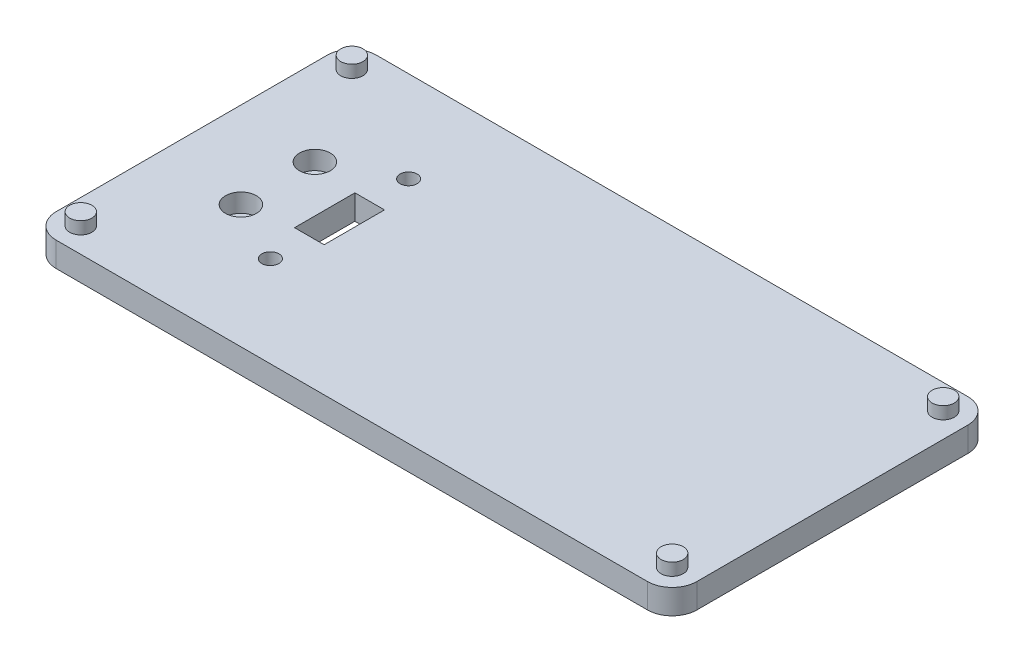
ISO-10303-21;
HEADER;
FILE_DESCRIPTION(('STEP AP214'),'2;1');
FILE_NAME('part.step','',(''),(''),'','','');
FILE_SCHEMA(('AUTOMOTIVE_DESIGN { 1 0 10303 214 1 1 1 1 }'));
ENDSEC;
DATA;
#1=APPLICATION_CONTEXT('core data for automotive mechanical design processes');
#2=APPLICATION_PROTOCOL_DEFINITION('international standard','automotive_design',2000,#1);
#3=PRODUCT_CONTEXT('',#1,'mechanical');
#4=PRODUCT('Part','Part','',(#3));
#5=PRODUCT_RELATED_PRODUCT_CATEGORY('part','',(#4));
#6=PRODUCT_DEFINITION_FORMATION('','',#4);
#7=PRODUCT_DEFINITION_CONTEXT('part definition',#1,'design');
#8=PRODUCT_DEFINITION('design','',#6,#7);
#9=PRODUCT_DEFINITION_SHAPE('','',#8);
#10=(LENGTH_UNIT() NAMED_UNIT(*) SI_UNIT(.MILLI.,.METRE.));
#11=(NAMED_UNIT(*) PLANE_ANGLE_UNIT() SI_UNIT($,.RADIAN.));
#12=(NAMED_UNIT(*) SI_UNIT($,.STERADIAN.) SOLID_ANGLE_UNIT());
#13=UNCERTAINTY_MEASURE_WITH_UNIT(LENGTH_MEASURE(1.E-05),#10,'distance_accuracy_value','');
#14=(GEOMETRIC_REPRESENTATION_CONTEXT(3) GLOBAL_UNCERTAINTY_ASSIGNED_CONTEXT((#13)) GLOBAL_UNIT_ASSIGNED_CONTEXT((#10,
#11,#12)) REPRESENTATION_CONTEXT('',''));
#15=CARTESIAN_POINT('',(0.,0.,0.));
#16=DIRECTION('',(0.,0.,1.));
#17=DIRECTION('',(1.,0.,0.));
#18=AXIS2_PLACEMENT_3D('',#15,#16,#17);
#19=CARTESIAN_POINT('',(0.,5.08,0.));
#20=DIRECTION('',(1.,0.,0.));
#21=DIRECTION('',(0.,0.,-1.));
#22=AXIS2_PLACEMENT_3D('',#19,#20,#21);
#23=PLANE('',#22);
#24=DIRECTION('',(0.,0.,1.));
#25=VECTOR('',#24,1.);
#26=CARTESIAN_POINT('',(0.,5.08,0.));
#27=LINE('',#26,#25);
#28=CARTESIAN_POINT('',(0.,5.08,-60.96));
#29=VERTEX_POINT('',#28);
#30=CARTESIAN_POINT('',(0.,5.08,-5.08));
#31=VERTEX_POINT('',#30);
#32=EDGE_CURVE('E169',#29,#31,#27,.T.);
#33=ORIENTED_EDGE('',*,*,#32,.F.);
#34=DIRECTION('',(0.,-1.,0.));
#35=VECTOR('',#34,1.);
#36=CARTESIAN_POINT('',(0.,5.08,-60.96));
#37=LINE('',#36,#35);
#38=CARTESIAN_POINT('',(0.,0.,-60.96));
#39=VERTEX_POINT('',#38);
#40=EDGE_CURVE('E184',#29,#39,#37,.T.);
#41=ORIENTED_EDGE('',*,*,#40,.T.);
#42=DIRECTION('',(0.,0.,1.));
#43=VECTOR('',#42,1.);
#44=CARTESIAN_POINT('',(0.,0.,0.));
#45=LINE('',#44,#43);
#46=CARTESIAN_POINT('',(0.,0.,-5.08));
#47=VERTEX_POINT('',#46);
#48=EDGE_CURVE('E138',#39,#47,#45,.T.);
#49=ORIENTED_EDGE('',*,*,#48,.T.);
#50=DIRECTION('',(0.,-1.,0.));
#51=VECTOR('',#50,1.);
#52=CARTESIAN_POINT('',(0.,5.08,-5.08));
#53=LINE('',#52,#51);
#54=EDGE_CURVE('E177',#47,#31,#53,.F.);
#55=ORIENTED_EDGE('',*,*,#54,.T.);
#56=EDGE_LOOP('',(#33,#41,#49,#55));
#57=FACE_BOUND('',#56,.T.);
#58=ADVANCED_FACE('F35',(#57),#23,.F.);
#59=CARTESIAN_POINT('',(0.,5.08,0.));
#60=DIRECTION('',(0.,0.,-1.));
#61=DIRECTION('',(-1.,0.,0.));
#62=AXIS2_PLACEMENT_3D('',#59,#60,#61);
#63=PLANE('',#62);
#64=DIRECTION('',(1.,0.,0.));
#65=VECTOR('',#64,1.);
#66=CARTESIAN_POINT('',(0.,0.,0.));
#67=LINE('',#66,#65);
#68=CARTESIAN_POINT('',(5.08,0.,0.));
#69=VERTEX_POINT('',#68);
#70=CARTESIAN_POINT('',(127.,0.,0.));
#71=VERTEX_POINT('',#70);
#72=EDGE_CURVE('E180',#69,#71,#67,.T.);
#73=ORIENTED_EDGE('',*,*,#72,.T.);
#74=DIRECTION('',(0.,-1.,0.));
#75=VECTOR('',#74,1.);
#76=CARTESIAN_POINT('',(127.,5.08,0.));
#77=LINE('',#76,#75);
#78=CARTESIAN_POINT('',(127.,5.08,0.));
#79=VERTEX_POINT('',#78);
#80=EDGE_CURVE('E58',#71,#79,#77,.F.);
#81=ORIENTED_EDGE('',*,*,#80,.T.);
#82=DIRECTION('',(1.,0.,0.));
#83=VECTOR('',#82,1.);
#84=CARTESIAN_POINT('',(0.,5.08,0.));
#85=LINE('',#84,#83);
#86=CARTESIAN_POINT('',(5.08,5.08,0.));
#87=VERTEX_POINT('',#86);
#88=EDGE_CURVE('E172',#87,#79,#85,.T.);
#89=ORIENTED_EDGE('',*,*,#88,.F.);
#90=DIRECTION('',(0.,-1.,0.));
#91=VECTOR('',#90,1.);
#92=CARTESIAN_POINT('',(5.08,5.08,0.));
#93=LINE('',#92,#91);
#94=EDGE_CURVE('E199',#87,#69,#93,.T.);
#95=ORIENTED_EDGE('',*,*,#94,.T.);
#96=EDGE_LOOP('',(#73,#81,#89,#95));
#97=FACE_BOUND('',#96,.T.);
#98=ADVANCED_FACE('F324',(#97),#63,.F.);
#99=CARTESIAN_POINT('',(0.,5.08,-66.04));
#100=DIRECTION('',(0.,0.,1.));
#101=DIRECTION('',(1.,0.,0.));
#102=AXIS2_PLACEMENT_3D('',#99,#100,#101);
#103=PLANE('',#102);
#104=DIRECTION('',(-1.,0.,0.));
#105=VECTOR('',#104,1.);
#106=CARTESIAN_POINT('',(0.,5.08,-66.04));
#107=LINE('',#106,#105);
#108=CARTESIAN_POINT('',(127.,5.08,-66.04));
#109=VERTEX_POINT('',#108);
#110=CARTESIAN_POINT('',(5.07999999999999,5.08,-66.04));
#111=VERTEX_POINT('',#110);
#112=EDGE_CURVE('E175',#109,#111,#107,.T.);
#113=ORIENTED_EDGE('',*,*,#112,.F.);
#114=DIRECTION('',(0.,-1.,0.));
#115=VECTOR('',#114,1.);
#116=CARTESIAN_POINT('',(127.,0.,-66.04));
#117=LINE('',#116,#115);
#118=CARTESIAN_POINT('',(127.,0.,-66.04));
#119=VERTEX_POINT('',#118);
#120=EDGE_CURVE('E215',#109,#119,#117,.T.);
#121=ORIENTED_EDGE('',*,*,#120,.T.);
#122=DIRECTION('',(-1.,0.,0.));
#123=VECTOR('',#122,1.);
#124=CARTESIAN_POINT('',(0.,0.,-66.04));
#125=LINE('',#124,#123);
#126=CARTESIAN_POINT('',(5.07999999999999,0.,-66.04));
#127=VERTEX_POINT('',#126);
#128=EDGE_CURVE('E173',#119,#127,#125,.T.);
#129=ORIENTED_EDGE('',*,*,#128,.T.);
#130=DIRECTION('',(0.,-1.,0.));
#131=VECTOR('',#130,1.);
#132=CARTESIAN_POINT('',(5.07999999999999,5.08,-66.04));
#133=LINE('',#132,#131);
#134=EDGE_CURVE('E192',#127,#111,#133,.F.);
#135=ORIENTED_EDGE('',*,*,#134,.T.);
#136=EDGE_LOOP('',(#113,#121,#129,#135));
#137=FACE_BOUND('',#136,.T.);
#138=ADVANCED_FACE('F231',(#137),#103,.F.);
#139=CARTESIAN_POINT('',(0.,5.08,0.));
#140=DIRECTION('',(0.,-1.,0.));
#141=DIRECTION('',(0.,0.,-1.));
#142=AXIS2_PLACEMENT_3D('',#139,#140,#141);
#143=PLANE('',#142);
#144=CARTESIAN_POINT('',(5.07999999999999,5.08,-5.08));
#145=DIRECTION('',(0.,-1.,0.));
#146=DIRECTION('',(0.,0.,-1.));
#147=AXIS2_PLACEMENT_3D('',#144,#145,#146);
#148=CIRCLE('',#147,2.286);
#149=CARTESIAN_POINT('',(5.07999999999999,5.08,-7.366));
#150=VERTEX_POINT('',#149);
#151=EDGE_CURVE('E11',#150,#150,#148,.F.);
#152=ORIENTED_EDGE('',*,*,#151,.F.);
#153=EDGE_LOOP('',(#152));
#154=FACE_BOUND('',#153,.T.);
#155=CARTESIAN_POINT('',(127.,5.08,-5.08));
#156=DIRECTION('',(0.,-1.,0.));
#157=DIRECTION('',(0.,0.,-1.));
#158=AXIS2_PLACEMENT_3D('',#155,#156,#157);
#159=CIRCLE('',#158,2.28600000000001);
#160=CARTESIAN_POINT('',(127.,5.08,-7.36600000000001));
#161=VERTEX_POINT('',#160);
#162=EDGE_CURVE('E43',#161,#161,#159,.F.);
#163=ORIENTED_EDGE('',*,*,#162,.F.);
#164=EDGE_LOOP('',(#163));
#165=FACE_BOUND('',#164,.T.);
#166=CARTESIAN_POINT('',(127.,5.08,-60.96));
#167=DIRECTION('',(0.,-1.,0.));
#168=DIRECTION('',(0.,0.,-1.));
#169=AXIS2_PLACEMENT_3D('',#166,#167,#168);
#170=CIRCLE('',#169,2.28600000000001);
#171=CARTESIAN_POINT('',(127.,5.08,-63.246));
#172=VERTEX_POINT('',#171);
#173=EDGE_CURVE('E221',#172,#172,#170,.F.);
#174=ORIENTED_EDGE('',*,*,#173,.F.);
#175=EDGE_LOOP('',(#174));
#176=FACE_BOUND('',#175,.T.);
#177=CARTESIAN_POINT('',(5.07999999999999,5.08,-60.96));
#178=DIRECTION('',(0.,-1.,0.));
#179=DIRECTION('',(0.,0.,-1.));
#180=AXIS2_PLACEMENT_3D('',#177,#178,#179);
#181=CIRCLE('',#180,2.286);
#182=CARTESIAN_POINT('',(5.07999999999999,5.08,-63.246));
#183=VERTEX_POINT('',#182);
#184=EDGE_CURVE('E218',#183,#183,#181,.F.);
#185=ORIENTED_EDGE('',*,*,#184,.F.);
#186=EDGE_LOOP('',(#185));
#187=FACE_BOUND('',#186,.T.);
#188=CARTESIAN_POINT('',(17.78,5.08,-40.64));
#189=DIRECTION('',(0.,1.,0.));
#190=DIRECTION('',(0.,0.,1.));
#191=AXIS2_PLACEMENT_3D('',#188,#189,#190);
#192=CIRCLE('',#191,3.175);
#193=CARTESIAN_POINT('',(17.78,5.08,-37.465));
#194=VERTEX_POINT('',#193);
#195=EDGE_CURVE('E241',#194,#194,#192,.T.);
#196=ORIENTED_EDGE('',*,*,#195,.F.);
#197=EDGE_LOOP('',(#196));
#198=FACE_BOUND('',#197,.T.);
#199=CARTESIAN_POINT('',(17.78,5.08,-25.4));
#200=DIRECTION('',(0.,1.,0.));
#201=DIRECTION('',(0.,0.,1.));
#202=AXIS2_PLACEMENT_3D('',#199,#200,#201);
#203=CIRCLE('',#202,3.175);
#204=CARTESIAN_POINT('',(17.78,5.08,-22.225));
#205=VERTEX_POINT('',#204);
#206=EDGE_CURVE('E245',#205,#205,#203,.T.);
#207=ORIENTED_EDGE('',*,*,#206,.F.);
#208=EDGE_LOOP('',(#207));
#209=FACE_BOUND('',#208,.T.);
#210=CARTESIAN_POINT('',(30.48,5.08,-18.7706));
#211=DIRECTION('',(0.,1.,0.));
#212=DIRECTION('',(0.,0.,-1.));
#213=AXIS2_PLACEMENT_3D('',#210,#211,#212);
#214=CIRCLE('',#213,1.75259999999999);
#215=CARTESIAN_POINT('',(30.48,5.08,-20.5232));
#216=VERTEX_POINT('',#215);
#217=EDGE_CURVE('E249',#216,#216,#214,.T.);
#218=ORIENTED_EDGE('',*,*,#217,.F.);
#219=EDGE_LOOP('',(#218));
#220=FACE_BOUND('',#219,.T.);
#221=CARTESIAN_POINT('',(30.48,5.08,-47.2694));
#222=DIRECTION('',(0.,1.,0.));
#223=DIRECTION('',(0.,0.,1.));
#224=AXIS2_PLACEMENT_3D('',#221,#222,#223);
#225=CIRCLE('',#224,1.75259999999999);
#226=CARTESIAN_POINT('',(30.48,5.08,-45.5168));
#227=VERTEX_POINT('',#226);
#228=EDGE_CURVE('E253',#227,#227,#225,.T.);
#229=ORIENTED_EDGE('',*,*,#228,.F.);
#230=EDGE_LOOP('',(#229));
#231=FACE_BOUND('',#230,.T.);
#232=DIRECTION('',(1.,0.,0.));
#233=VECTOR('',#232,1.);
#234=CARTESIAN_POINT('',(27.432,5.08,-26.797));
#235=LINE('',#234,#233);
#236=CARTESIAN_POINT('',(27.432,5.08,-26.797));
#237=VERTEX_POINT('',#236);
#238=CARTESIAN_POINT('',(33.528,5.08,-26.797));
#239=VERTEX_POINT('',#238);
#240=EDGE_CURVE('E153',#237,#239,#235,.T.);
#241=ORIENTED_EDGE('',*,*,#240,.F.);
#242=DIRECTION('',(0.,0.,1.));
#243=VECTOR('',#242,1.);
#244=CARTESIAN_POINT('',(27.432,5.08,-39.243));
#245=LINE('',#244,#243);
#246=CARTESIAN_POINT('',(27.432,5.08,-39.243));
#247=VERTEX_POINT('',#246);
#248=EDGE_CURVE('E146',#247,#237,#245,.T.);
#249=ORIENTED_EDGE('',*,*,#248,.F.);
#250=DIRECTION('',(-1.,0.,0.));
#251=VECTOR('',#250,1.);
#252=CARTESIAN_POINT('',(27.432,5.08,-39.243));
#253=LINE('',#252,#251);
#254=CARTESIAN_POINT('',(33.528,5.08,-39.243));
#255=VERTEX_POINT('',#254);
#256=EDGE_CURVE('E147',#255,#247,#253,.T.);
#257=ORIENTED_EDGE('',*,*,#256,.F.);
#258=DIRECTION('',(0.,0.,-1.));
#259=VECTOR('',#258,1.);
#260=CARTESIAN_POINT('',(33.528,5.08,-39.243));
#261=LINE('',#260,#259);
#262=EDGE_CURVE('E160',#239,#255,#261,.T.);
#263=ORIENTED_EDGE('',*,*,#262,.F.);
#264=EDGE_LOOP('',(#241,#249,#257,#263));
#265=FACE_BOUND('',#264,.T.);
#266=ORIENTED_EDGE('',*,*,#88,.T.);
#267=CARTESIAN_POINT('',(127.,5.08,-5.08));
#268=DIRECTION('',(0.,-1.,0.));
#269=DIRECTION('',(0.,0.,-1.));
#270=AXIS2_PLACEMENT_3D('',#267,#268,#269);
#271=CIRCLE('',#270,5.08);
#272=CARTESIAN_POINT('',(132.08,5.08,-5.08));
#273=VERTEX_POINT('',#272);
#274=EDGE_CURVE('E213',#79,#273,#271,.F.);
#275=ORIENTED_EDGE('',*,*,#274,.T.);
#276=DIRECTION('',(0.,0.,1.));
#277=VECTOR('',#276,1.);
#278=CARTESIAN_POINT('',(132.08,5.08,0.));
#279=LINE('',#278,#277);
#280=CARTESIAN_POINT('',(132.08,5.08,-60.96));
#281=VERTEX_POINT('',#280);
#282=EDGE_CURVE('E268',#281,#273,#279,.T.);
#283=ORIENTED_EDGE('',*,*,#282,.F.);
#284=CARTESIAN_POINT('',(127.,5.08,-60.96));
#285=DIRECTION('',(0.,-1.,0.));
#286=DIRECTION('',(0.,0.,-1.));
#287=AXIS2_PLACEMENT_3D('',#284,#285,#286);
#288=CIRCLE('',#287,5.08);
#289=EDGE_CURVE('E50',#281,#109,#288,.F.);
#290=ORIENTED_EDGE('',*,*,#289,.T.);
#291=ORIENTED_EDGE('',*,*,#112,.T.);
#292=CARTESIAN_POINT('',(5.07999999999999,5.08,-60.96));
#293=DIRECTION('',(0.,-1.,0.));
#294=DIRECTION('',(0.,0.,-1.));
#295=AXIS2_PLACEMENT_3D('',#292,#293,#294);
#296=CIRCLE('',#295,5.08);
#297=EDGE_CURVE('E197',#111,#29,#296,.F.);
#298=ORIENTED_EDGE('',*,*,#297,.T.);
#299=ORIENTED_EDGE('',*,*,#32,.T.);
#300=CARTESIAN_POINT('',(5.08,5.08,-5.08));
#301=DIRECTION('',(0.,-1.,0.));
#302=DIRECTION('',(0.,0.,-1.));
#303=AXIS2_PLACEMENT_3D('',#300,#301,#302);
#304=CIRCLE('',#303,5.08);
#305=EDGE_CURVE('E195',#31,#87,#304,.F.);
#306=ORIENTED_EDGE('',*,*,#305,.T.);
#307=EDGE_LOOP('',(#266,#275,#283,#290,#291,#298,#299,#306));
#308=FACE_BOUND('',#307,.T.);
#309=ADVANCED_FACE('F228',(#154,#165,#176,#187,#198,#209,#220,#231,#265,#308),#143,.F.);
#310=CARTESIAN_POINT('',(0.,0.,0.));
#311=DIRECTION('',(0.,-1.,0.));
#312=DIRECTION('',(0.,0.,-1.));
#313=AXIS2_PLACEMENT_3D('',#310,#311,#312);
#314=PLANE('',#313);
#315=DIRECTION('',(0.,0.,1.));
#316=VECTOR('',#315,1.);
#317=CARTESIAN_POINT('',(132.08,0.,0.));
#318=LINE('',#317,#316);
#319=CARTESIAN_POINT('',(132.08,0.,-60.96));
#320=VERTEX_POINT('',#319);
#321=CARTESIAN_POINT('',(132.08,0.,-5.08));
#322=VERTEX_POINT('',#321);
#323=EDGE_CURVE('E266',#320,#322,#318,.T.);
#324=ORIENTED_EDGE('',*,*,#323,.T.);
#325=CARTESIAN_POINT('',(127.,0.,-5.08));
#326=DIRECTION('',(0.,-1.,0.));
#327=DIRECTION('',(0.,0.,-1.));
#328=AXIS2_PLACEMENT_3D('',#325,#326,#327);
#329=CIRCLE('',#328,5.08);
#330=EDGE_CURVE('E209',#322,#71,#329,.T.);
#331=ORIENTED_EDGE('',*,*,#330,.T.);
#332=ORIENTED_EDGE('',*,*,#72,.F.);
#333=CARTESIAN_POINT('',(5.08,0.,-5.08));
#334=DIRECTION('',(0.,-1.,0.));
#335=DIRECTION('',(0.,0.,-1.));
#336=AXIS2_PLACEMENT_3D('',#333,#334,#335);
#337=CIRCLE('',#336,5.08);
#338=EDGE_CURVE('E187',#69,#47,#337,.T.);
#339=ORIENTED_EDGE('',*,*,#338,.T.);
#340=ORIENTED_EDGE('',*,*,#48,.F.);
#341=CARTESIAN_POINT('',(5.07999999999999,0.,-60.96));
#342=DIRECTION('',(0.,-1.,0.));
#343=DIRECTION('',(0.,0.,-1.));
#344=AXIS2_PLACEMENT_3D('',#341,#342,#343);
#345=CIRCLE('',#344,5.08);
#346=EDGE_CURVE('E189',#39,#127,#345,.T.);
#347=ORIENTED_EDGE('',*,*,#346,.T.);
#348=ORIENTED_EDGE('',*,*,#128,.F.);
#349=CARTESIAN_POINT('',(127.,0.,-60.96));
#350=DIRECTION('',(0.,-1.,0.));
#351=DIRECTION('',(0.,0.,-1.));
#352=AXIS2_PLACEMENT_3D('',#349,#350,#351);
#353=CIRCLE('',#352,5.08);
#354=EDGE_CURVE('E207',#119,#320,#353,.T.);
#355=ORIENTED_EDGE('',*,*,#354,.T.);
#356=EDGE_LOOP('',(#324,#331,#332,#339,#340,#347,#348,#355));
#357=FACE_BOUND('',#356,.T.);
#358=CARTESIAN_POINT('',(17.78,0.,-40.64));
#359=DIRECTION('',(0.,-1.,0.));
#360=DIRECTION('',(0.,0.,-1.));
#361=AXIS2_PLACEMENT_3D('',#358,#359,#360);
#362=CIRCLE('',#361,1.9812);
#363=CARTESIAN_POINT('',(17.78,0.,-42.6212));
#364=VERTEX_POINT('',#363);
#365=EDGE_CURVE('E284',#364,#364,#362,.F.);
#366=ORIENTED_EDGE('',*,*,#365,.T.);
#367=EDGE_LOOP('',(#366));
#368=FACE_BOUND('',#367,.T.);
#369=CARTESIAN_POINT('',(17.78,0.,-25.4));
#370=DIRECTION('',(0.,-1.,0.));
#371=DIRECTION('',(0.,0.,-1.));
#372=AXIS2_PLACEMENT_3D('',#369,#370,#371);
#373=CIRCLE('',#372,1.9812);
#374=CARTESIAN_POINT('',(17.78,0.,-27.3812));
#375=VERTEX_POINT('',#374);
#376=EDGE_CURVE('E275',#375,#375,#373,.F.);
#377=ORIENTED_EDGE('',*,*,#376,.T.);
#378=EDGE_LOOP('',(#377));
#379=FACE_BOUND('',#378,.T.);
#380=CARTESIAN_POINT('',(30.48,0.,-18.7706));
#381=DIRECTION('',(0.,-1.,0.));
#382=DIRECTION('',(0.,0.,-1.));
#383=AXIS2_PLACEMENT_3D('',#380,#381,#382);
#384=CIRCLE('',#383,1.75259999999999);
#385=CARTESIAN_POINT('',(30.48,0.,-20.5232));
#386=VERTEX_POINT('',#385);
#387=EDGE_CURVE('E295',#386,#386,#384,.F.);
#388=ORIENTED_EDGE('',*,*,#387,.T.);
#389=EDGE_LOOP('',(#388));
#390=FACE_BOUND('',#389,.T.);
#391=CARTESIAN_POINT('',(30.48,0.,-47.2694));
#392=DIRECTION('',(0.,-1.,0.));
#393=DIRECTION('',(0.,0.,-1.));
#394=AXIS2_PLACEMENT_3D('',#391,#392,#393);
#395=CIRCLE('',#394,1.75259999999999);
#396=CARTESIAN_POINT('',(30.48,0.,-49.022));
#397=VERTEX_POINT('',#396);
#398=EDGE_CURVE('E302',#397,#397,#395,.F.);
#399=ORIENTED_EDGE('',*,*,#398,.T.);
#400=EDGE_LOOP('',(#399));
#401=FACE_BOUND('',#400,.T.);
#402=DIRECTION('',(0.,0.,1.));
#403=VECTOR('',#402,1.);
#404=CARTESIAN_POINT('',(27.432,0.,-39.243));
#405=LINE('',#404,#403);
#406=CARTESIAN_POINT('',(27.432,0.,-39.243));
#407=VERTEX_POINT('',#406);
#408=CARTESIAN_POINT('',(27.432,0.,-26.797));
#409=VERTEX_POINT('',#408);
#410=EDGE_CURVE('E143',#407,#409,#405,.T.);
#411=ORIENTED_EDGE('',*,*,#410,.T.);
#412=DIRECTION('',(1.,0.,0.));
#413=VECTOR('',#412,1.);
#414=CARTESIAN_POINT('',(27.432,0.,-26.797));
#415=LINE('',#414,#413);
#416=CARTESIAN_POINT('',(33.528,0.,-26.797));
#417=VERTEX_POINT('',#416);
#418=EDGE_CURVE('E127',#409,#417,#415,.T.);
#419=ORIENTED_EDGE('',*,*,#418,.T.);
#420=DIRECTION('',(0.,0.,-1.));
#421=VECTOR('',#420,1.);
#422=CARTESIAN_POINT('',(33.528,0.,-39.243));
#423=LINE('',#422,#421);
#424=CARTESIAN_POINT('',(33.528,0.,-39.243));
#425=VERTEX_POINT('',#424);
#426=EDGE_CURVE('E155',#417,#425,#423,.T.);
#427=ORIENTED_EDGE('',*,*,#426,.T.);
#428=DIRECTION('',(-1.,0.,0.));
#429=VECTOR('',#428,1.);
#430=CARTESIAN_POINT('',(27.432,0.,-39.243));
#431=LINE('',#430,#429);
#432=EDGE_CURVE('E151',#425,#407,#431,.T.);
#433=ORIENTED_EDGE('',*,*,#432,.T.);
#434=EDGE_LOOP('',(#411,#419,#427,#433));
#435=FACE_BOUND('',#434,.T.);
#436=ADVANCED_FACE('F150',(#357,#368,#379,#390,#401,#435),#314,.T.);
#437=CARTESIAN_POINT('',(5.07999999999999,5.08,-60.96));
#438=DIRECTION('',(0.,-1.,0.));
#439=DIRECTION('',(0.,0.,-1.));
#440=AXIS2_PLACEMENT_3D('',#437,#438,#439);
#441=CYLINDRICAL_SURFACE('',#440,5.08);
#442=ORIENTED_EDGE('',*,*,#297,.F.);
#443=ORIENTED_EDGE('',*,*,#134,.F.);
#444=ORIENTED_EDGE('',*,*,#346,.F.);
#445=ORIENTED_EDGE('',*,*,#40,.F.);
#446=EDGE_LOOP('',(#442,#443,#444,#445));
#447=FACE_BOUND('',#446,.T.);
#448=ADVANCED_FACE('F334',(#447),#441,.T.);
#449=CARTESIAN_POINT('',(5.08,5.08,-5.08));
#450=DIRECTION('',(0.,-1.,0.));
#451=DIRECTION('',(0.,0.,-1.));
#452=AXIS2_PLACEMENT_3D('',#449,#450,#451);
#453=CYLINDRICAL_SURFACE('',#452,5.08);
#454=ORIENTED_EDGE('',*,*,#305,.F.);
#455=ORIENTED_EDGE('',*,*,#54,.F.);
#456=ORIENTED_EDGE('',*,*,#338,.F.);
#457=ORIENTED_EDGE('',*,*,#94,.F.);
#458=EDGE_LOOP('',(#454,#455,#456,#457));
#459=FACE_BOUND('',#458,.T.);
#460=ADVANCED_FACE('F320',(#459),#453,.T.);
#461=CARTESIAN_POINT('',(27.432,-0.00100000000000013,-39.243));
#462=DIRECTION('',(-1.,0.,0.));
#463=DIRECTION('',(0.,0.,1.));
#464=AXIS2_PLACEMENT_3D('',#461,#462,#463);
#465=PLANE('',#464);
#466=DIRECTION('',(0.,1.,0.));
#467=VECTOR('',#466,1.);
#468=CARTESIAN_POINT('',(27.432,-0.00100000000000013,-39.243));
#469=LINE('',#468,#467);
#470=EDGE_CURVE('E139',#407,#247,#469,.T.);
#471=ORIENTED_EDGE('',*,*,#470,.T.);
#472=ORIENTED_EDGE('',*,*,#248,.T.);
#473=DIRECTION('',(0.,1.,0.));
#474=VECTOR('',#473,1.);
#475=CARTESIAN_POINT('',(27.432,-0.00100000000000013,-26.797));
#476=LINE('',#475,#474);
#477=EDGE_CURVE('E131',#409,#237,#476,.T.);
#478=ORIENTED_EDGE('',*,*,#477,.F.);
#479=ORIENTED_EDGE('',*,*,#410,.F.);
#480=EDGE_LOOP('',(#471,#472,#478,#479));
#481=FACE_BOUND('',#480,.T.);
#482=ADVANCED_FACE('F142',(#481),#465,.F.);
#483=CARTESIAN_POINT('',(27.432,-0.00100000000000013,-39.243));
#484=DIRECTION('',(0.,0.,-1.));
#485=DIRECTION('',(-1.,0.,0.));
#486=AXIS2_PLACEMENT_3D('',#483,#484,#485);
#487=PLANE('',#486);
#488=DIRECTION('',(0.,1.,0.));
#489=VECTOR('',#488,1.);
#490=CARTESIAN_POINT('',(33.528,-0.00100000000000013,-39.243));
#491=LINE('',#490,#489);
#492=EDGE_CURVE('E166',#425,#255,#491,.T.);
#493=ORIENTED_EDGE('',*,*,#492,.T.);
#494=ORIENTED_EDGE('',*,*,#256,.T.);
#495=ORIENTED_EDGE('',*,*,#470,.F.);
#496=ORIENTED_EDGE('',*,*,#432,.F.);
#497=EDGE_LOOP('',(#493,#494,#495,#496));
#498=FACE_BOUND('',#497,.T.);
#499=ADVANCED_FACE('F312',(#498),#487,.F.);
#500=CARTESIAN_POINT('',(33.528,-0.00100000000000013,-39.243));
#501=DIRECTION('',(1.,0.,0.));
#502=DIRECTION('',(0.,0.,-1.));
#503=AXIS2_PLACEMENT_3D('',#500,#501,#502);
#504=PLANE('',#503);
#505=DIRECTION('',(0.,1.,0.));
#506=VECTOR('',#505,1.);
#507=CARTESIAN_POINT('',(33.528,-0.00100000000000013,-26.797));
#508=LINE('',#507,#506);
#509=EDGE_CURVE('E133',#417,#239,#508,.T.);
#510=ORIENTED_EDGE('',*,*,#509,.T.);
#511=ORIENTED_EDGE('',*,*,#262,.T.);
#512=ORIENTED_EDGE('',*,*,#492,.F.);
#513=ORIENTED_EDGE('',*,*,#426,.F.);
#514=EDGE_LOOP('',(#510,#511,#512,#513));
#515=FACE_BOUND('',#514,.T.);
#516=ADVANCED_FACE('F309',(#515),#504,.F.);
#517=CARTESIAN_POINT('',(27.432,-0.00100000000000013,-26.797));
#518=DIRECTION('',(0.,0.,1.));
#519=DIRECTION('',(1.,0.,0.));
#520=AXIS2_PLACEMENT_3D('',#517,#518,#519);
#521=PLANE('',#520);
#522=ORIENTED_EDGE('',*,*,#477,.T.);
#523=ORIENTED_EDGE('',*,*,#240,.T.);
#524=ORIENTED_EDGE('',*,*,#509,.F.);
#525=ORIENTED_EDGE('',*,*,#418,.F.);
#526=EDGE_LOOP('',(#522,#523,#524,#525));
#527=FACE_BOUND('',#526,.T.);
#528=ADVANCED_FACE('F129',(#527),#521,.F.);
#529=CARTESIAN_POINT('',(30.48,-0.00100000000000013,-47.2694));
#530=DIRECTION('',(0.,1.,0.));
#531=DIRECTION('',(0.,0.,1.));
#532=AXIS2_PLACEMENT_3D('',#529,#530,#531);
#533=CYLINDRICAL_SURFACE('',#532,1.75259999999999);
#534=ORIENTED_EDGE('',*,*,#398,.F.);
#535=EDGE_LOOP('',(#534));
#536=FACE_BOUND('',#535,.T.);
#537=ORIENTED_EDGE('',*,*,#228,.T.);
#538=EDGE_LOOP('',(#537));
#539=FACE_BOUND('',#538,.T.);
#540=ADVANCED_FACE('F378',(#536,#539),#533,.F.);
#541=CARTESIAN_POINT('',(30.48,-0.00100000000000013,-18.7706));
#542=DIRECTION('',(0.,1.,0.));
#543=DIRECTION('',(0.,0.,1.));
#544=AXIS2_PLACEMENT_3D('',#541,#542,#543);
#545=CYLINDRICAL_SURFACE('',#544,1.75259999999999);
#546=ORIENTED_EDGE('',*,*,#387,.F.);
#547=EDGE_LOOP('',(#546));
#548=FACE_BOUND('',#547,.T.);
#549=ORIENTED_EDGE('',*,*,#217,.T.);
#550=EDGE_LOOP('',(#549));
#551=FACE_BOUND('',#550,.T.);
#552=ADVANCED_FACE('F376',(#548,#551),#545,.F.);
#553=CARTESIAN_POINT('',(17.78,1.27,-25.4));
#554=DIRECTION('',(0.,1.,0.));
#555=DIRECTION('',(0.,0.,1.));
#556=AXIS2_PLACEMENT_3D('',#553,#554,#555);
#557=CYLINDRICAL_SURFACE('',#556,3.175);
#558=CARTESIAN_POINT('',(17.78,1.27,-25.4));
#559=DIRECTION('',(0.,1.,0.));
#560=DIRECTION('',(0.,0.,1.));
#561=AXIS2_PLACEMENT_3D('',#558,#559,#560);
#562=CIRCLE('',#561,3.175);
#563=CARTESIAN_POINT('',(17.78,1.27,-22.225));
#564=VERTEX_POINT('',#563);
#565=EDGE_CURVE('E297',#564,#564,#562,.T.);
#566=CARTESIAN_POINT('',(17.78,1.27,-22.225));
#567=CARTESIAN_POINT('',(17.78,1.3096875,-22.225));
#568=CARTESIAN_POINT('',(17.78,1.349375,-22.225));
#569=CARTESIAN_POINT('',(17.78,1.42875,-22.225));
#570=CARTESIAN_POINT('',(17.78,1.4684375,-22.225));
#571=CARTESIAN_POINT('',(17.78,1.5478125,-22.225));
#572=CARTESIAN_POINT('',(17.78,1.5875,-22.225));
#573=CARTESIAN_POINT('',(17.78,1.666875,-22.225));
#574=CARTESIAN_POINT('',(17.78,1.7065625,-22.225));
#575=CARTESIAN_POINT('',(17.78,1.7859375,-22.225));
#576=CARTESIAN_POINT('',(17.78,1.825625,-22.225));
#577=CARTESIAN_POINT('',(17.78,1.905,-22.225));
#578=CARTESIAN_POINT('',(17.78,1.9446875,-22.225));
#579=CARTESIAN_POINT('',(17.78,2.0240625,-22.225));
#580=CARTESIAN_POINT('',(17.78,2.06375,-22.225));
#581=CARTESIAN_POINT('',(17.78,2.143125,-22.225));
#582=CARTESIAN_POINT('',(17.78,2.1828125,-22.225));
#583=CARTESIAN_POINT('',(17.78,2.2621875,-22.225));
#584=CARTESIAN_POINT('',(17.78,2.301875,-22.225));
#585=CARTESIAN_POINT('',(17.78,2.38125,-22.225));
#586=CARTESIAN_POINT('',(17.78,2.4209375,-22.225));
#587=CARTESIAN_POINT('',(17.78,2.5003125,-22.225));
#588=CARTESIAN_POINT('',(17.78,2.54,-22.225));
#589=CARTESIAN_POINT('',(17.78,2.619375,-22.225));
#590=CARTESIAN_POINT('',(17.78,2.6590625,-22.225));
#591=CARTESIAN_POINT('',(17.78,2.7384375,-22.225));
#592=CARTESIAN_POINT('',(17.78,2.778125,-22.225));
#593=CARTESIAN_POINT('',(17.78,2.8575,-22.225));
#594=CARTESIAN_POINT('',(17.78,2.8971875,-22.225));
#595=CARTESIAN_POINT('',(17.78,2.9765625,-22.225));
#596=CARTESIAN_POINT('',(17.78,3.01625,-22.225));
#597=CARTESIAN_POINT('',(17.78,3.095625,-22.225));
#598=CARTESIAN_POINT('',(17.78,3.1353125,-22.225));
#599=CARTESIAN_POINT('',(17.78,3.2146875,-22.225));
#600=CARTESIAN_POINT('',(17.78,3.254375,-22.225));
#601=CARTESIAN_POINT('',(17.78,3.33375,-22.225));
#602=CARTESIAN_POINT('',(17.78,3.3734375,-22.225));
#603=CARTESIAN_POINT('',(17.78,3.4528125,-22.225));
#604=CARTESIAN_POINT('',(17.78,3.4925,-22.225));
#605=CARTESIAN_POINT('',(17.78,3.571875,-22.225));
#606=CARTESIAN_POINT('',(17.78,3.6115625,-22.225));
#607=CARTESIAN_POINT('',(17.78,3.6909375,-22.225));
#608=CARTESIAN_POINT('',(17.78,3.730625,-22.225));
#609=CARTESIAN_POINT('',(17.78,3.81,-22.225));
#610=CARTESIAN_POINT('',(17.78,3.8496875,-22.225));
#611=CARTESIAN_POINT('',(17.78,3.9290625,-22.225));
#612=CARTESIAN_POINT('',(17.78,3.96875,-22.225));
#613=CARTESIAN_POINT('',(17.78,4.048125,-22.225));
#614=CARTESIAN_POINT('',(17.78,4.0878125,-22.225));
#615=CARTESIAN_POINT('',(17.78,4.1671875,-22.225));
#616=CARTESIAN_POINT('',(17.78,4.206875,-22.225));
#617=CARTESIAN_POINT('',(17.78,4.28625,-22.225));
#618=CARTESIAN_POINT('',(17.78,4.3259375,-22.225));
#619=CARTESIAN_POINT('',(17.78,4.4053125,-22.225));
#620=CARTESIAN_POINT('',(17.78,4.445,-22.225));
#621=CARTESIAN_POINT('',(17.78,4.524375,-22.225));
#622=CARTESIAN_POINT('',(17.78,4.5640625,-22.225));
#623=CARTESIAN_POINT('',(17.78,4.6434375,-22.225));
#624=CARTESIAN_POINT('',(17.78,4.683125,-22.225));
#625=CARTESIAN_POINT('',(17.78,4.7625,-22.225));
#626=CARTESIAN_POINT('',(17.78,4.8021875,-22.225));
#627=CARTESIAN_POINT('',(17.78,4.8815625,-22.225));
#628=CARTESIAN_POINT('',(17.78,4.92125,-22.225));
#629=CARTESIAN_POINT('',(17.78,5.000625,-22.225));
#630=CARTESIAN_POINT('',(17.78,5.0403125,-22.225));
#631=CARTESIAN_POINT('',(17.78,5.08,-22.225));
#632=B_SPLINE_CURVE_WITH_KNOTS('',3,(#566,#567,#568,#569,#570,#571,#572,#573,#574,#575,#576,
#577,#578,#579,#580,#581,#582,#583,#584,#585,#586,#587,#588,#589,#590,#591,#592,#593,#594,#595,
#596,#597,#598,#599,#600,#601,#602,#603,#604,#605,#606,#607,#608,#609,#610,#611,#612,#613,#614,
#615,#616,#617,#618,#619,#620,#621,#622,#623,#624,#625,#626,#627,#628,#629,#630,#631),
.UNSPECIFIED.,.F.,.F.,(4,2,2,2,2,2,2,2,2,2,2,2,2,2,2,2,2,2,2,2,2,2,2,2,2,2,2,2,2,2,2,2,4),(0.,
0.1190625,0.238125,0.3571875,0.47625,0.5953125,0.714375,0.833437499999999,0.9525,1.0715625,
1.190625,1.3096875,1.42875,1.5478125,1.666875,1.7859375,1.905,2.0240625,2.143125,2.2621875,
2.38125,2.5003125,2.619375,2.7384375,2.8575,2.9765625,3.095625,3.2146875,3.33375,3.4528125,
3.571875,3.6909375,3.81),.UNSPECIFIED.);
#633=EDGE_CURVE('BSEAM372',#564,#205,#632,.T.);
#634=ORIENTED_EDGE('',*,*,#565,.F.);
#635=ORIENTED_EDGE('',*,*,#206,.T.);
#636=ORIENTED_EDGE('',*,*,#633,.T.);
#637=ORIENTED_EDGE('',*,*,#633,.F.);
#638=EDGE_LOOP('',(#634,#636,#635,#637));
#639=FACE_BOUND('',#638,.T.);
#640=ADVANCED_FACE('F372',(#639),#557,.F.);
#641=CARTESIAN_POINT('',(17.78,1.27,-25.4));
#642=DIRECTION('',(0.,1.,0.));
#643=DIRECTION('',(0.,0.,1.));
#644=AXIS2_PLACEMENT_3D('',#641,#642,#643);
#645=PLANE('',#644);
#646=CARTESIAN_POINT('',(17.78,1.27,-25.4));
#647=DIRECTION('',(0.,1.,0.));
#648=DIRECTION('',(0.,0.,1.));
#649=AXIS2_PLACEMENT_3D('',#646,#647,#648);
#650=CIRCLE('',#649,1.9812);
#651=CARTESIAN_POINT('',(17.78,1.27,-23.4188));
#652=VERTEX_POINT('',#651);
#653=EDGE_CURVE('E287',#652,#652,#650,.T.);
#654=ORIENTED_EDGE('',*,*,#653,.F.);
#655=EDGE_LOOP('',(#654));
#656=FACE_BOUND('',#655,.T.);
#657=ORIENTED_EDGE('',*,*,#565,.T.);
#658=EDGE_LOOP('',(#657));
#659=FACE_BOUND('',#658,.T.);
#660=ADVANCED_FACE('F368',(#656,#659),#645,.T.);
#661=CARTESIAN_POINT('',(17.78,1.27,-40.64));
#662=DIRECTION('',(0.,1.,0.));
#663=DIRECTION('',(0.,0.,1.));
#664=AXIS2_PLACEMENT_3D('',#661,#662,#663);
#665=CYLINDRICAL_SURFACE('',#664,3.175);
#666=CARTESIAN_POINT('',(17.78,1.27,-40.64));
#667=DIRECTION('',(0.,1.,0.));
#668=DIRECTION('',(0.,0.,1.));
#669=AXIS2_PLACEMENT_3D('',#666,#667,#668);
#670=CIRCLE('',#669,3.175);
#671=CARTESIAN_POINT('',(17.78,1.27,-37.465));
#672=VERTEX_POINT('',#671);
#673=EDGE_CURVE('E292',#672,#672,#670,.T.);
#674=CARTESIAN_POINT('',(17.78,1.27,-37.465));
#675=CARTESIAN_POINT('',(17.78,1.3096875,-37.465));
#676=CARTESIAN_POINT('',(17.78,1.349375,-37.465));
#677=CARTESIAN_POINT('',(17.78,1.42875,-37.465));
#678=CARTESIAN_POINT('',(17.78,1.4684375,-37.465));
#679=CARTESIAN_POINT('',(17.78,1.5478125,-37.465));
#680=CARTESIAN_POINT('',(17.78,1.5875,-37.465));
#681=CARTESIAN_POINT('',(17.78,1.666875,-37.465));
#682=CARTESIAN_POINT('',(17.78,1.7065625,-37.465));
#683=CARTESIAN_POINT('',(17.78,1.7859375,-37.465));
#684=CARTESIAN_POINT('',(17.78,1.825625,-37.465));
#685=CARTESIAN_POINT('',(17.78,1.905,-37.465));
#686=CARTESIAN_POINT('',(17.78,1.9446875,-37.465));
#687=CARTESIAN_POINT('',(17.78,2.0240625,-37.465));
#688=CARTESIAN_POINT('',(17.78,2.06375,-37.465));
#689=CARTESIAN_POINT('',(17.78,2.143125,-37.465));
#690=CARTESIAN_POINT('',(17.78,2.1828125,-37.465));
#691=CARTESIAN_POINT('',(17.78,2.2621875,-37.465));
#692=CARTESIAN_POINT('',(17.78,2.301875,-37.465));
#693=CARTESIAN_POINT('',(17.78,2.38125,-37.465));
#694=CARTESIAN_POINT('',(17.78,2.4209375,-37.465));
#695=CARTESIAN_POINT('',(17.78,2.5003125,-37.465));
#696=CARTESIAN_POINT('',(17.78,2.54,-37.465));
#697=CARTESIAN_POINT('',(17.78,2.619375,-37.465));
#698=CARTESIAN_POINT('',(17.78,2.6590625,-37.465));
#699=CARTESIAN_POINT('',(17.78,2.7384375,-37.465));
#700=CARTESIAN_POINT('',(17.78,2.778125,-37.465));
#701=CARTESIAN_POINT('',(17.78,2.8575,-37.465));
#702=CARTESIAN_POINT('',(17.78,2.8971875,-37.465));
#703=CARTESIAN_POINT('',(17.78,2.9765625,-37.465));
#704=CARTESIAN_POINT('',(17.78,3.01625,-37.465));
#705=CARTESIAN_POINT('',(17.78,3.095625,-37.465));
#706=CARTESIAN_POINT('',(17.78,3.1353125,-37.465));
#707=CARTESIAN_POINT('',(17.78,3.2146875,-37.465));
#708=CARTESIAN_POINT('',(17.78,3.254375,-37.465));
#709=CARTESIAN_POINT('',(17.78,3.33375,-37.465));
#710=CARTESIAN_POINT('',(17.78,3.3734375,-37.465));
#711=CARTESIAN_POINT('',(17.78,3.4528125,-37.465));
#712=CARTESIAN_POINT('',(17.78,3.4925,-37.465));
#713=CARTESIAN_POINT('',(17.78,3.571875,-37.465));
#714=CARTESIAN_POINT('',(17.78,3.6115625,-37.465));
#715=CARTESIAN_POINT('',(17.78,3.6909375,-37.465));
#716=CARTESIAN_POINT('',(17.78,3.730625,-37.465));
#717=CARTESIAN_POINT('',(17.78,3.81,-37.465));
#718=CARTESIAN_POINT('',(17.78,3.8496875,-37.465));
#719=CARTESIAN_POINT('',(17.78,3.9290625,-37.465));
#720=CARTESIAN_POINT('',(17.78,3.96875,-37.465));
#721=CARTESIAN_POINT('',(17.78,4.048125,-37.465));
#722=CARTESIAN_POINT('',(17.78,4.0878125,-37.465));
#723=CARTESIAN_POINT('',(17.78,4.1671875,-37.465));
#724=CARTESIAN_POINT('',(17.78,4.206875,-37.465));
#725=CARTESIAN_POINT('',(17.78,4.28625,-37.465));
#726=CARTESIAN_POINT('',(17.78,4.3259375,-37.465));
#727=CARTESIAN_POINT('',(17.78,4.4053125,-37.465));
#728=CARTESIAN_POINT('',(17.78,4.445,-37.465));
#729=CARTESIAN_POINT('',(17.78,4.524375,-37.465));
#730=CARTESIAN_POINT('',(17.78,4.5640625,-37.465));
#731=CARTESIAN_POINT('',(17.78,4.6434375,-37.465));
#732=CARTESIAN_POINT('',(17.78,4.683125,-37.465));
#733=CARTESIAN_POINT('',(17.78,4.7625,-37.465));
#734=CARTESIAN_POINT('',(17.78,4.8021875,-37.465));
#735=CARTESIAN_POINT('',(17.78,4.8815625,-37.465));
#736=CARTESIAN_POINT('',(17.78,4.92125,-37.465));
#737=CARTESIAN_POINT('',(17.78,5.000625,-37.465));
#738=CARTESIAN_POINT('',(17.78,5.0403125,-37.465));
#739=CARTESIAN_POINT('',(17.78,5.08,-37.465));
#740=B_SPLINE_CURVE_WITH_KNOTS('',3,(#674,#675,#676,#677,#678,#679,#680,#681,#682,#683,#684,
#685,#686,#687,#688,#689,#690,#691,#692,#693,#694,#695,#696,#697,#698,#699,#700,#701,#702,#703,
#704,#705,#706,#707,#708,#709,#710,#711,#712,#713,#714,#715,#716,#717,#718,#719,#720,#721,#722,
#723,#724,#725,#726,#727,#728,#729,#730,#731,#732,#733,#734,#735,#736,#737,#738,#739),
.UNSPECIFIED.,.F.,.F.,(4,2,2,2,2,2,2,2,2,2,2,2,2,2,2,2,2,2,2,2,2,2,2,2,2,2,2,2,2,2,2,2,4),(0.,
0.1190625,0.238125,0.3571875,0.47625,0.5953125,0.714375,0.833437499999999,0.9525,1.0715625,
1.190625,1.3096875,1.42875,1.5478125,1.666875,1.7859375,1.905,2.0240625,2.143125,2.2621875,
2.38125,2.5003125,2.619375,2.7384375,2.8575,2.9765625,3.095625,3.2146875,3.33375,3.4528125,
3.571875,3.6909375,3.81),.UNSPECIFIED.);
#741=EDGE_CURVE('BSEAM364',#672,#194,#740,.T.);
#742=ORIENTED_EDGE('',*,*,#673,.F.);
#743=ORIENTED_EDGE('',*,*,#195,.T.);
#744=ORIENTED_EDGE('',*,*,#741,.T.);
#745=ORIENTED_EDGE('',*,*,#741,.F.);
#746=EDGE_LOOP('',(#742,#744,#743,#745));
#747=FACE_BOUND('',#746,.T.);
#748=ADVANCED_FACE('F364',(#747),#665,.F.);
#749=CARTESIAN_POINT('',(17.78,1.27,-40.64));
#750=DIRECTION('',(0.,1.,0.));
#751=DIRECTION('',(0.,0.,1.));
#752=AXIS2_PLACEMENT_3D('',#749,#750,#751);
#753=PLANE('',#752);
#754=CARTESIAN_POINT('',(17.78,1.27,-40.64));
#755=DIRECTION('',(0.,1.,0.));
#756=DIRECTION('',(0.,0.,1.));
#757=AXIS2_PLACEMENT_3D('',#754,#755,#756);
#758=CIRCLE('',#757,1.9812);
#759=CARTESIAN_POINT('',(17.78,1.27,-38.6588));
#760=VERTEX_POINT('',#759);
#761=EDGE_CURVE('E281',#760,#760,#758,.T.);
#762=ORIENTED_EDGE('',*,*,#761,.F.);
#763=EDGE_LOOP('',(#762));
#764=FACE_BOUND('',#763,.T.);
#765=ORIENTED_EDGE('',*,*,#673,.T.);
#766=EDGE_LOOP('',(#765));
#767=FACE_BOUND('',#766,.T.);
#768=ADVANCED_FACE('F360',(#764,#767),#753,.T.);
#769=CARTESIAN_POINT('',(17.78,-0.000999999999999916,-25.4));
#770=DIRECTION('',(0.,1.,0.));
#771=DIRECTION('',(0.,0.,1.));
#772=AXIS2_PLACEMENT_3D('',#769,#770,#771);
#773=CYLINDRICAL_SURFACE('',#772,1.9812);
#774=ORIENTED_EDGE('',*,*,#376,.F.);
#775=EDGE_LOOP('',(#774));
#776=FACE_BOUND('',#775,.T.);
#777=ORIENTED_EDGE('',*,*,#653,.T.);
#778=EDGE_LOOP('',(#777));
#779=FACE_BOUND('',#778,.T.);
#780=ADVANCED_FACE('F352',(#776,#779),#773,.F.);
#781=CARTESIAN_POINT('',(17.78,-0.000999999999999916,-40.64));
#782=DIRECTION('',(0.,1.,0.));
#783=DIRECTION('',(0.,0.,1.));
#784=AXIS2_PLACEMENT_3D('',#781,#782,#783);
#785=CYLINDRICAL_SURFACE('',#784,1.9812);
#786=ORIENTED_EDGE('',*,*,#365,.F.);
#787=EDGE_LOOP('',(#786));
#788=FACE_BOUND('',#787,.T.);
#789=ORIENTED_EDGE('',*,*,#761,.T.);
#790=EDGE_LOOP('',(#789));
#791=FACE_BOUND('',#790,.T.);
#792=ADVANCED_FACE('F347',(#788,#791),#785,.F.);
#793=CARTESIAN_POINT('',(132.08,5.08,0.));
#794=DIRECTION('',(1.,0.,0.));
#795=DIRECTION('',(0.,0.,-1.));
#796=AXIS2_PLACEMENT_3D('',#793,#794,#795);
#797=PLANE('',#796);
#798=ORIENTED_EDGE('',*,*,#282,.T.);
#799=DIRECTION('',(0.,-1.,0.));
#800=VECTOR('',#799,1.);
#801=CARTESIAN_POINT('',(132.08,0.,-5.08));
#802=LINE('',#801,#800);
#803=EDGE_CURVE('E204',#273,#322,#802,.T.);
#804=ORIENTED_EDGE('',*,*,#803,.T.);
#805=ORIENTED_EDGE('',*,*,#323,.F.);
#806=DIRECTION('',(0.,-1.,0.));
#807=VECTOR('',#806,1.);
#808=CARTESIAN_POINT('',(132.08,5.08,-60.96));
#809=LINE('',#808,#807);
#810=EDGE_CURVE('E202',#320,#281,#809,.F.);
#811=ORIENTED_EDGE('',*,*,#810,.T.);
#812=EDGE_LOOP('',(#798,#804,#805,#811));
#813=FACE_BOUND('',#812,.T.);
#814=ADVANCED_FACE('F265',(#813),#797,.T.);
#815=CARTESIAN_POINT('',(127.,5.08,-5.08));
#816=DIRECTION('',(0.,1.,0.));
#817=DIRECTION('',(0.,0.,1.));
#818=AXIS2_PLACEMENT_3D('',#815,#816,#817);
#819=CYLINDRICAL_SURFACE('',#818,5.08);
#820=ORIENTED_EDGE('',*,*,#274,.F.);
#821=ORIENTED_EDGE('',*,*,#80,.F.);
#822=ORIENTED_EDGE('',*,*,#330,.F.);
#823=ORIENTED_EDGE('',*,*,#803,.F.);
#824=EDGE_LOOP('',(#820,#821,#822,#823));
#825=FACE_BOUND('',#824,.T.);
#826=ADVANCED_FACE('F261',(#825),#819,.T.);
#827=CARTESIAN_POINT('',(127.,5.08,-60.96));
#828=DIRECTION('',(0.,1.,0.));
#829=DIRECTION('',(0.,0.,1.));
#830=AXIS2_PLACEMENT_3D('',#827,#828,#829);
#831=CYLINDRICAL_SURFACE('',#830,5.08);
#832=ORIENTED_EDGE('',*,*,#289,.F.);
#833=ORIENTED_EDGE('',*,*,#810,.F.);
#834=ORIENTED_EDGE('',*,*,#354,.F.);
#835=ORIENTED_EDGE('',*,*,#120,.F.);
#836=EDGE_LOOP('',(#832,#833,#834,#835));
#837=FACE_BOUND('',#836,.T.);
#838=ADVANCED_FACE('F37',(#837),#831,.T.);
#839=CARTESIAN_POINT('',(5.07999999999999,7.62,-60.96));
#840=DIRECTION('',(0.,-1.,0.));
#841=DIRECTION('',(0.,0.,-1.));
#842=AXIS2_PLACEMENT_3D('',#839,#840,#841);
#843=CYLINDRICAL_SURFACE('',#842,2.286);
#844=CARTESIAN_POINT('',(5.07999999999999,7.62,-60.96));
#845=DIRECTION('',(0.,1.,0.));
#846=DIRECTION('',(0.,0.,1.));
#847=AXIS2_PLACEMENT_3D('',#844,#845,#846);
#848=CIRCLE('',#847,2.286);
#849=CARTESIAN_POINT('',(5.07999999999999,7.62,-58.674));
#850=VERTEX_POINT('',#849);
#851=EDGE_CURVE('E273',#850,#850,#848,.T.);
#852=ORIENTED_EDGE('',*,*,#851,.F.);
#853=EDGE_LOOP('',(#852));
#854=FACE_BOUND('',#853,.T.);
#855=ORIENTED_EDGE('',*,*,#184,.T.);
#856=EDGE_LOOP('',(#855));
#857=FACE_BOUND('',#856,.T.);
#858=ADVANCED_FACE('F345',(#854,#857),#843,.T.);
#859=CARTESIAN_POINT('',(5.07999999999999,7.62,-60.96));
#860=DIRECTION('',(0.,1.,0.));
#861=DIRECTION('',(0.,0.,1.));
#862=AXIS2_PLACEMENT_3D('',#859,#860,#861);
#863=PLANE('',#862);
#864=ORIENTED_EDGE('',*,*,#851,.T.);
#865=EDGE_LOOP('',(#864));
#866=FACE_BOUND('',#865,.T.);
#867=ADVANCED_FACE('F425',(#866),#863,.T.);
#868=CARTESIAN_POINT('',(127.,7.62,-60.96));
#869=DIRECTION('',(0.,-1.,0.));
#870=DIRECTION('',(0.,0.,-1.));
#871=AXIS2_PLACEMENT_3D('',#868,#869,#870);
#872=CYLINDRICAL_SURFACE('',#871,2.28600000000001);
#873=CARTESIAN_POINT('',(127.,7.62,-60.96));
#874=DIRECTION('',(0.,1.,0.));
#875=DIRECTION('',(0.,0.,-1.));
#876=AXIS2_PLACEMENT_3D('',#873,#874,#875);
#877=CIRCLE('',#876,2.28600000000001);
#878=CARTESIAN_POINT('',(127.,7.62,-63.246));
#879=VERTEX_POINT('',#878);
#880=EDGE_CURVE('E278',#879,#879,#877,.T.);
#881=ORIENTED_EDGE('',*,*,#880,.F.);
#882=EDGE_LOOP('',(#881));
#883=FACE_BOUND('',#882,.T.);
#884=ORIENTED_EDGE('',*,*,#173,.T.);
#885=EDGE_LOOP('',(#884));
#886=FACE_BOUND('',#885,.T.);
#887=ADVANCED_FACE('F434',(#883,#886),#872,.T.);
#888=CARTESIAN_POINT('',(127.,7.62,-60.96));
#889=DIRECTION('',(0.,-1.,0.));
#890=DIRECTION('',(0.,0.,-1.));
#891=AXIS2_PLACEMENT_3D('',#888,#889,#890);
#892=PLANE('',#891);
#893=ORIENTED_EDGE('',*,*,#880,.T.);
#894=EDGE_LOOP('',(#893));
#895=FACE_BOUND('',#894,.T.);
#896=ADVANCED_FACE('F443',(#895),#892,.F.);
#897=CARTESIAN_POINT('',(127.,7.62,-5.08));
#898=DIRECTION('',(0.,-1.,0.));
#899=DIRECTION('',(0.,0.,-1.));
#900=AXIS2_PLACEMENT_3D('',#897,#898,#899);
#901=CYLINDRICAL_SURFACE('',#900,2.28600000000001);
#902=CARTESIAN_POINT('',(127.,7.62,-5.08));
#903=DIRECTION('',(0.,1.,0.));
#904=DIRECTION('',(0.,0.,1.));
#905=AXIS2_PLACEMENT_3D('',#902,#903,#904);
#906=CIRCLE('',#905,2.28600000000001);
#907=CARTESIAN_POINT('',(127.,7.62,-2.79399999999999));
#908=VERTEX_POINT('',#907);
#909=EDGE_CURVE('E499',#908,#908,#906,.T.);
#910=ORIENTED_EDGE('',*,*,#909,.F.);
#911=EDGE_LOOP('',(#910));
#912=FACE_BOUND('',#911,.T.);
#913=ORIENTED_EDGE('',*,*,#162,.T.);
#914=EDGE_LOOP('',(#913));
#915=FACE_BOUND('',#914,.T.);
#916=ADVANCED_FACE('F226',(#912,#915),#901,.T.);
#917=CARTESIAN_POINT('',(127.,7.62,-5.08));
#918=DIRECTION('',(0.,1.,0.));
#919=DIRECTION('',(0.,0.,1.));
#920=AXIS2_PLACEMENT_3D('',#917,#918,#919);
#921=PLANE('',#920);
#922=ORIENTED_EDGE('',*,*,#909,.T.);
#923=EDGE_LOOP('',(#922));
#924=FACE_BOUND('',#923,.T.);
#925=ADVANCED_FACE('F462',(#924),#921,.T.);
#926=CARTESIAN_POINT('',(5.07999999999999,7.62,-5.08));
#927=DIRECTION('',(0.,-1.,0.));
#928=DIRECTION('',(0.,0.,-1.));
#929=AXIS2_PLACEMENT_3D('',#926,#927,#928);
#930=CYLINDRICAL_SURFACE('',#929,2.286);
#931=CARTESIAN_POINT('',(5.07999999999999,7.62,-5.08));
#932=DIRECTION('',(0.,1.,0.));
#933=DIRECTION('',(0.,0.,-1.));
#934=AXIS2_PLACEMENT_3D('',#931,#932,#933);
#935=CIRCLE('',#934,2.286);
#936=CARTESIAN_POINT('',(5.07999999999999,7.62,-7.366));
#937=VERTEX_POINT('',#936);
#938=EDGE_CURVE('E498',#937,#937,#935,.T.);
#939=ORIENTED_EDGE('',*,*,#938,.F.);
#940=EDGE_LOOP('',(#939));
#941=FACE_BOUND('',#940,.T.);
#942=ORIENTED_EDGE('',*,*,#151,.T.);
#943=EDGE_LOOP('',(#942));
#944=FACE_BOUND('',#943,.T.);
#945=ADVANCED_FACE('F472',(#941,#944),#930,.T.);
#946=CARTESIAN_POINT('',(5.07999999999999,7.62,-5.08));
#947=DIRECTION('',(0.,-1.,0.));
#948=DIRECTION('',(0.,0.,-1.));
#949=AXIS2_PLACEMENT_3D('',#946,#947,#948);
#950=PLANE('',#949);
#951=ORIENTED_EDGE('',*,*,#938,.T.);
#952=EDGE_LOOP('',(#951));
#953=FACE_BOUND('',#952,.T.);
#954=ADVANCED_FACE('F482',(#953),#950,.F.);
#955=CLOSED_SHELL('',(#58,#98,#138,#309,#436,#448,#460,#482,#499,#516,#528,#540,#552,#640,#660,
#748,#768,#780,#792,#814,#826,#838,#858,#867,#887,#896,#916,#925,#945,#954));
#956=MANIFOLD_SOLID_BREP('B2',#955);
#957=ADVANCED_BREP_SHAPE_REPRESENTATION('',(#18,#956),#14);
#958=SHAPE_DEFINITION_REPRESENTATION(#9,#957);
ENDSEC;
END-ISO-10303-21;
